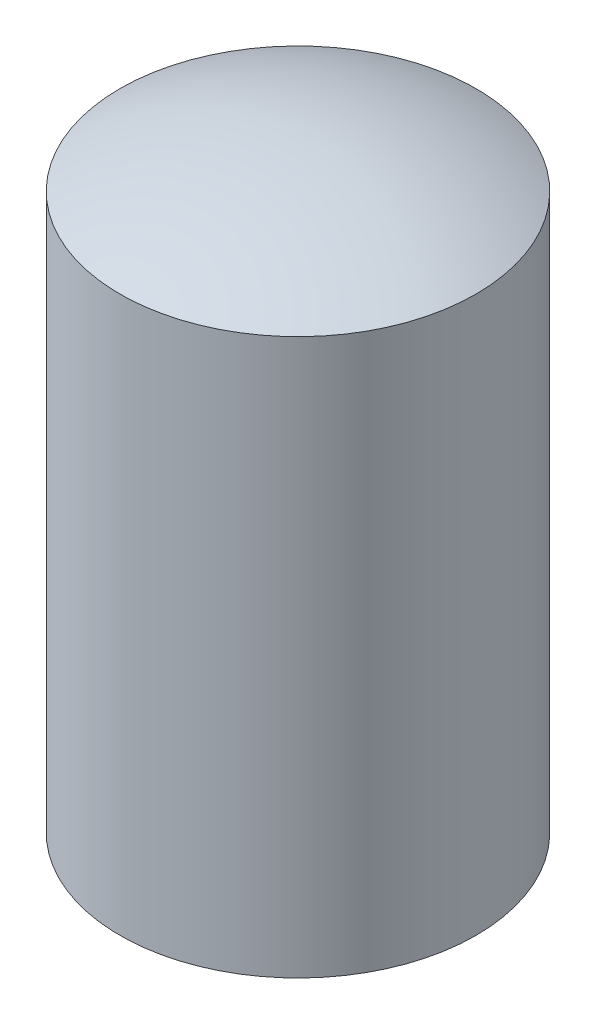
ISO-10303-21;
HEADER;
FILE_DESCRIPTION(('STEP AP214'),'2;1');
FILE_NAME('part.step','',(''),(''),'','','');
FILE_SCHEMA(('AUTOMOTIVE_DESIGN { 1 0 10303 214 1 1 1 1 }'));
ENDSEC;
DATA;
#1=APPLICATION_CONTEXT('core data for automotive mechanical design processes');
#2=APPLICATION_PROTOCOL_DEFINITION('international standard','automotive_design',2000,#1);
#3=PRODUCT_CONTEXT('',#1,'mechanical');
#4=PRODUCT('Part','Part','',(#3));
#5=PRODUCT_RELATED_PRODUCT_CATEGORY('part','',(#4));
#6=PRODUCT_DEFINITION_FORMATION('','',#4);
#7=PRODUCT_DEFINITION_CONTEXT('part definition',#1,'design');
#8=PRODUCT_DEFINITION('design','',#6,#7);
#9=PRODUCT_DEFINITION_SHAPE('','',#8);
#10=(LENGTH_UNIT() NAMED_UNIT(*) SI_UNIT(.MILLI.,.METRE.));
#11=(NAMED_UNIT(*) PLANE_ANGLE_UNIT() SI_UNIT($,.RADIAN.));
#12=(NAMED_UNIT(*) SI_UNIT($,.STERADIAN.) SOLID_ANGLE_UNIT());
#13=UNCERTAINTY_MEASURE_WITH_UNIT(LENGTH_MEASURE(1.E-05),#10,'distance_accuracy_value','');
#14=(GEOMETRIC_REPRESENTATION_CONTEXT(3) GLOBAL_UNCERTAINTY_ASSIGNED_CONTEXT((#13)) GLOBAL_UNIT_ASSIGNED_CONTEXT((#10,
#11,#12)) REPRESENTATION_CONTEXT('',''));
#15=CARTESIAN_POINT('',(0.,0.,0.));
#16=DIRECTION('',(0.,0.,1.));
#17=DIRECTION('',(1.,0.,0.));
#18=AXIS2_PLACEMENT_3D('',#15,#16,#17);
#19=CARTESIAN_POINT('',(0.,-11.0166666666667,0.));
#20=DIRECTION('',(0.,1.,0.));
#21=DIRECTION('',(1.,0.,0.));
#22=AXIS2_PLACEMENT_3D('',#19,#20,#21);
#23=SPHERICAL_SURFACE('',#22,11.0166666666667);
#24=CARTESIAN_POINT('',(0.,-1.2,0.));
#25=DIRECTION('',(0.,1.,0.));
#26=DIRECTION('',(-1.,0.,0.));
#27=AXIS2_PLACEMENT_3D('',#24,#25,#26);
#28=CIRCLE('',#27,5.);
#29=CARTESIAN_POINT('',(-5.,-1.2,0.));
#30=VERTEX_POINT('',#29);
#31=EDGE_CURVE('E10',#30,#30,#28,.T.);
#32=ORIENTED_EDGE('',*,*,#31,.T.);
#33=EDGE_LOOP('',(#32));
#34=FACE_BOUND('',#33,.T.);
#35=ADVANCED_FACE('F36',(#34),#23,.T.);
#36=CARTESIAN_POINT('',(0.,5.,0.));
#37=DIRECTION('',(0.,1.,0.));
#38=DIRECTION('',(-1.,0.,0.));
#39=AXIS2_PLACEMENT_3D('',#36,#37,#38);
#40=CYLINDRICAL_SURFACE('',#39,5.);
#41=ORIENTED_EDGE('',*,*,#31,.F.);
#42=EDGE_LOOP('',(#41));
#43=FACE_BOUND('',#42,.T.);
#44=CARTESIAN_POINT('',(0.,-16.8,0.));
#45=DIRECTION('',(0.,1.,0.));
#46=DIRECTION('',(-1.,0.,0.));
#47=AXIS2_PLACEMENT_3D('',#44,#45,#46);
#48=CIRCLE('',#47,5.);
#49=CARTESIAN_POINT('',(-5.,-16.8,0.));
#50=VERTEX_POINT('',#49);
#51=EDGE_CURVE('E42',#50,#50,#48,.T.);
#52=ORIENTED_EDGE('',*,*,#51,.T.);
#53=EDGE_LOOP('',(#52));
#54=FACE_BOUND('',#53,.T.);
#55=ADVANCED_FACE('F48',(#43,#54),#40,.T.);
#56=CARTESIAN_POINT('',(0.,-6.98333333333334,0.));
#57=DIRECTION('',(0.,1.,0.));
#58=DIRECTION('',(1.,0.,0.));
#59=AXIS2_PLACEMENT_3D('',#56,#57,#58);
#60=SPHERICAL_SURFACE('',#59,11.0166666666667);
#61=ORIENTED_EDGE('',*,*,#51,.F.);
#62=EDGE_LOOP('',(#61));
#63=FACE_BOUND('',#62,.T.);
#64=ADVANCED_FACE('F50',(#63),#60,.T.);
#65=CLOSED_SHELL('',(#35,#55,#64));
#66=MANIFOLD_SOLID_BREP('B2',#65);
#67=ADVANCED_BREP_SHAPE_REPRESENTATION('',(#18,#66),#14);
#68=SHAPE_DEFINITION_REPRESENTATION(#9,#67);
ENDSEC;
END-ISO-10303-21;
